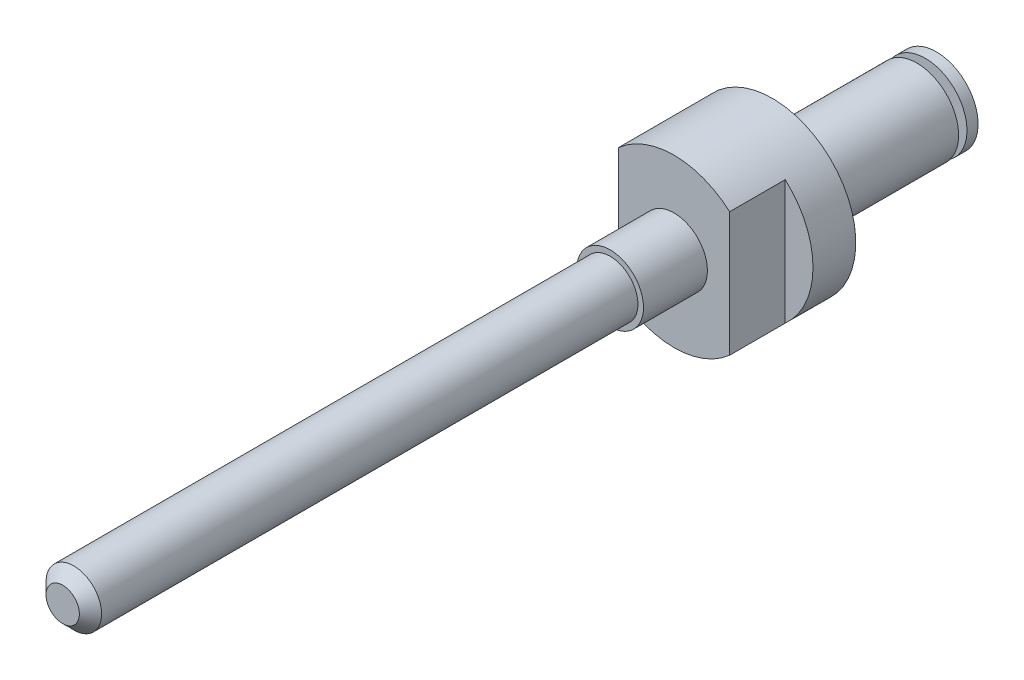
ISO-10303-21;
HEADER;
FILE_DESCRIPTION(('STEP AP214'),'2;1');
FILE_NAME('part.step','',(''),(''),'','','');
FILE_SCHEMA(('AUTOMOTIVE_DESIGN { 1 0 10303 214 1 1 1 1 }'));
ENDSEC;
DATA;
#1=APPLICATION_CONTEXT('core data for automotive mechanical design processes');
#2=APPLICATION_PROTOCOL_DEFINITION('international standard','automotive_design',2000,#1);
#3=PRODUCT_CONTEXT('',#1,'mechanical');
#4=PRODUCT('Part','Part','',(#3));
#5=PRODUCT_RELATED_PRODUCT_CATEGORY('part','',(#4));
#6=PRODUCT_DEFINITION_FORMATION('','',#4);
#7=PRODUCT_DEFINITION_CONTEXT('part definition',#1,'design');
#8=PRODUCT_DEFINITION('design','',#6,#7);
#9=PRODUCT_DEFINITION_SHAPE('','',#8);
#10=(LENGTH_UNIT() NAMED_UNIT(*) SI_UNIT(.MILLI.,.METRE.));
#11=(NAMED_UNIT(*) PLANE_ANGLE_UNIT() SI_UNIT($,.RADIAN.));
#12=(NAMED_UNIT(*) SI_UNIT($,.STERADIAN.) SOLID_ANGLE_UNIT());
#13=UNCERTAINTY_MEASURE_WITH_UNIT(LENGTH_MEASURE(1.E-05),#10,'distance_accuracy_value','');
#14=(GEOMETRIC_REPRESENTATION_CONTEXT(3) GLOBAL_UNCERTAINTY_ASSIGNED_CONTEXT((#13)) GLOBAL_UNIT_ASSIGNED_CONTEXT((#10,
#11,#12)) REPRESENTATION_CONTEXT('',''));
#15=CARTESIAN_POINT('',(0.,0.,0.));
#16=DIRECTION('',(0.,0.,1.));
#17=DIRECTION('',(1.,0.,0.));
#18=AXIS2_PLACEMENT_3D('',#15,#16,#17);
#19=CARTESIAN_POINT('',(0.,0.,11.));
#20=DIRECTION('',(0.,0.,-1.));
#21=DIRECTION('',(-1.,0.,0.));
#22=AXIS2_PLACEMENT_3D('',#19,#20,#21);
#23=CYLINDRICAL_SURFACE('',#22,0.6);
#24=CARTESIAN_POINT('',(0.,0.,0.));
#25=DIRECTION('',(0.,0.,1.));
#26=DIRECTION('',(1.,0.,0.));
#27=AXIS2_PLACEMENT_3D('',#24,#25,#26);
#28=CIRCLE('',#27,0.6);
#29=CARTESIAN_POINT('',(0.6,0.,0.));
#30=VERTEX_POINT('',#29);
#31=EDGE_CURVE('E90',#30,#30,#28,.T.);
#32=ORIENTED_EDGE('',*,*,#31,.T.);
#33=EDGE_LOOP('',(#32));
#34=FACE_BOUND('',#33,.T.);
#35=CARTESIAN_POINT('',(0.,0.,1.15));
#36=DIRECTION('',(0.,0.,1.));
#37=DIRECTION('',(1.,0.,0.));
#38=AXIS2_PLACEMENT_3D('',#35,#36,#37);
#39=CIRCLE('',#38,0.6);
#40=CARTESIAN_POINT('',(0.6,0.,1.15));
#41=VERTEX_POINT('',#40);
#42=EDGE_CURVE('E290',#41,#41,#39,.T.);
#43=ORIENTED_EDGE('',*,*,#42,.F.);
#44=EDGE_LOOP('',(#43));
#45=FACE_BOUND('',#44,.T.);
#46=ADVANCED_FACE('F33',(#34,#45),#23,.T.);
#47=CARTESIAN_POINT('',(0.,0.,0.));
#48=DIRECTION('',(0.,0.,1.));
#49=DIRECTION('',(1.,0.,0.));
#50=AXIS2_PLACEMENT_3D('',#47,#48,#49);
#51=PLANE('',#50);
#52=ORIENTED_EDGE('',*,*,#31,.F.);
#53=EDGE_LOOP('',(#52));
#54=FACE_BOUND('',#53,.T.);
#55=DIRECTION('',(0.,-1.,0.));
#56=VECTOR('',#55,1.);
#57=CARTESIAN_POINT('',(1.,1.5,0.));
#58=LINE('',#57,#56);
#59=CARTESIAN_POINT('',(1.,1.11803398874989,0.));
#60=VERTEX_POINT('',#59);
#61=CARTESIAN_POINT('',(1.,-1.11803398874989,0.));
#62=VERTEX_POINT('',#61);
#63=EDGE_CURVE('E76',#60,#62,#58,.T.);
#64=ORIENTED_EDGE('',*,*,#63,.F.);
#65=CARTESIAN_POINT('',(0.,0.,0.));
#66=DIRECTION('',(0.,0.,-1.));
#67=DIRECTION('',(-1.,0.,0.));
#68=AXIS2_PLACEMENT_3D('',#65,#66,#67);
#69=CIRCLE('',#68,1.5);
#70=CARTESIAN_POINT('',(-1.,1.11803398874989,0.));
#71=VERTEX_POINT('',#70);
#72=EDGE_CURVE('E88',#71,#60,#69,.T.);
#73=ORIENTED_EDGE('',*,*,#72,.F.);
#74=DIRECTION('',(0.,1.,0.));
#75=VECTOR('',#74,1.);
#76=CARTESIAN_POINT('',(-1.,1.5,0.));
#77=LINE('',#76,#75);
#78=CARTESIAN_POINT('',(-1.,-1.11803398874989,0.));
#79=VERTEX_POINT('',#78);
#80=EDGE_CURVE('E296',#79,#71,#77,.T.);
#81=ORIENTED_EDGE('',*,*,#80,.F.);
#82=EDGE_CURVE('E89',#62,#79,#69,.T.);
#83=ORIENTED_EDGE('',*,*,#82,.F.);
#84=EDGE_LOOP('',(#64,#73,#81,#83));
#85=FACE_BOUND('',#84,.T.);
#86=ADVANCED_FACE('F86',(#54,#85),#51,.T.);
#87=CARTESIAN_POINT('',(0.,0.,-4.72));
#88=DIRECTION('',(0.,0.,-1.));
#89=DIRECTION('',(-1.,0.,0.));
#90=AXIS2_PLACEMENT_3D('',#87,#88,#89);
#91=CYLINDRICAL_SURFACE('',#90,1.5);
#92=DIRECTION('',(0.,0.,-1.));
#93=VECTOR('',#92,1.);
#94=CARTESIAN_POINT('',(1.,1.11803398874989,-4.72));
#95=LINE('',#94,#93);
#96=CARTESIAN_POINT('',(1.,1.11803398874989,-1.));
#97=VERTEX_POINT('',#96);
#98=EDGE_CURVE('E73',#97,#60,#95,.F.);
#99=ORIENTED_EDGE('',*,*,#98,.F.);
#100=CARTESIAN_POINT('',(0.,0.,-1.));
#101=DIRECTION('',(0.,0.,1.));
#102=DIRECTION('',(1.,0.,0.));
#103=AXIS2_PLACEMENT_3D('',#100,#101,#102);
#104=CIRCLE('',#103,1.5);
#105=CARTESIAN_POINT('',(1.,-1.11803398874989,-1.));
#106=VERTEX_POINT('',#105);
#107=EDGE_CURVE('E108',#97,#106,#104,.F.);
#108=ORIENTED_EDGE('',*,*,#107,.T.);
#109=DIRECTION('',(0.,0.,-1.));
#110=VECTOR('',#109,1.);
#111=CARTESIAN_POINT('',(1.,-1.11803398874989,-4.72));
#112=LINE('',#111,#110);
#113=EDGE_CURVE('E81',#62,#106,#112,.T.);
#114=ORIENTED_EDGE('',*,*,#113,.F.);
#115=ORIENTED_EDGE('',*,*,#82,.T.);
#116=DIRECTION('',(0.,0.,-1.));
#117=VECTOR('',#116,1.);
#118=CARTESIAN_POINT('',(-1.,-1.1180339887499,-4.72));
#119=LINE('',#118,#117);
#120=CARTESIAN_POINT('',(-1.,-1.11803398874989,-1.));
#121=VERTEX_POINT('',#120);
#122=EDGE_CURVE('E105',#121,#79,#119,.F.);
#123=ORIENTED_EDGE('',*,*,#122,.F.);
#124=CARTESIAN_POINT('',(0.,0.,-1.));
#125=DIRECTION('',(0.,0.,1.));
#126=DIRECTION('',(1.,0.,0.));
#127=AXIS2_PLACEMENT_3D('',#124,#125,#126);
#128=CIRCLE('',#127,1.5);
#129=CARTESIAN_POINT('',(-1.,1.11803398874989,-1.));
#130=VERTEX_POINT('',#129);
#131=EDGE_CURVE('E97',#121,#130,#128,.F.);
#132=ORIENTED_EDGE('',*,*,#131,.T.);
#133=DIRECTION('',(0.,0.,-1.));
#134=VECTOR('',#133,1.);
#135=CARTESIAN_POINT('',(-1.,1.1180339887499,-4.72));
#136=LINE('',#135,#134);
#137=EDGE_CURVE('E96',#71,#130,#136,.T.);
#138=ORIENTED_EDGE('',*,*,#137,.F.);
#139=ORIENTED_EDGE('',*,*,#72,.T.);
#140=EDGE_LOOP('',(#99,#108,#114,#115,#123,#132,#138,#139));
#141=FACE_BOUND('',#140,.T.);
#142=CARTESIAN_POINT('',(0.,0.,-1.77));
#143=DIRECTION('',(0.,0.,-1.));
#144=DIRECTION('',(-1.,0.,0.));
#145=AXIS2_PLACEMENT_3D('',#142,#143,#144);
#146=CIRCLE('',#145,1.5);
#147=CARTESIAN_POINT('',(-1.5,0.,-1.77));
#148=VERTEX_POINT('',#147);
#149=EDGE_CURVE('E100',#148,#148,#146,.T.);
#150=ORIENTED_EDGE('',*,*,#149,.F.);
#151=EDGE_LOOP('',(#150));
#152=FACE_BOUND('',#151,.T.);
#153=ADVANCED_FACE('F93',(#141,#152),#91,.T.);
#154=CARTESIAN_POINT('',(-1.5,0.,-1.77));
#155=DIRECTION('',(0.,0.,-1.));
#156=DIRECTION('',(-1.,0.,0.));
#157=AXIS2_PLACEMENT_3D('',#154,#155,#156);
#158=PLANE('',#157);
#159=ORIENTED_EDGE('',*,*,#149,.T.);
#160=EDGE_LOOP('',(#159));
#161=FACE_BOUND('',#160,.T.);
#162=CARTESIAN_POINT('',(0.,0.,-1.77));
#163=DIRECTION('',(0.,0.,-1.));
#164=DIRECTION('',(-1.,0.,0.));
#165=AXIS2_PLACEMENT_3D('',#162,#163,#164);
#166=CIRCLE('',#165,0.75);
#167=CARTESIAN_POINT('',(-0.75,0.,-1.77));
#168=VERTEX_POINT('',#167);
#169=EDGE_CURVE('E314',#168,#168,#166,.T.);
#170=ORIENTED_EDGE('',*,*,#169,.F.);
#171=EDGE_LOOP('',(#170));
#172=FACE_BOUND('',#171,.T.);
#173=ADVANCED_FACE('F170',(#161,#172),#158,.T.);
#174=CARTESIAN_POINT('',(0.,0.,-4.72));
#175=DIRECTION('',(0.,0.,-1.));
#176=DIRECTION('',(-1.,0.,0.));
#177=AXIS2_PLACEMENT_3D('',#174,#175,#176);
#178=CYLINDRICAL_SURFACE('',#177,0.75);
#179=ORIENTED_EDGE('',*,*,#169,.T.);
#180=EDGE_LOOP('',(#179));
#181=FACE_BOUND('',#180,.T.);
#182=CARTESIAN_POINT('',(0.,0.,-4.37));
#183=DIRECTION('',(0.,0.,-1.));
#184=DIRECTION('',(-1.,0.,0.));
#185=AXIS2_PLACEMENT_3D('',#182,#183,#184);
#186=CIRCLE('',#185,0.75);
#187=CARTESIAN_POINT('',(-0.75,0.,-4.37));
#188=VERTEX_POINT('',#187);
#189=EDGE_CURVE('E312',#188,#188,#186,.T.);
#190=ORIENTED_EDGE('',*,*,#189,.F.);
#191=EDGE_LOOP('',(#190));
#192=FACE_BOUND('',#191,.T.);
#193=ADVANCED_FACE('F166',(#181,#192),#178,.T.);
#194=CARTESIAN_POINT('',(-0.75,0.,-4.37));
#195=DIRECTION('',(0.,0.,-1.));
#196=DIRECTION('',(-1.,0.,0.));
#197=AXIS2_PLACEMENT_3D('',#194,#195,#196);
#198=PLANE('',#197);
#199=ORIENTED_EDGE('',*,*,#189,.T.);
#200=EDGE_LOOP('',(#199));
#201=FACE_BOUND('',#200,.T.);
#202=CARTESIAN_POINT('',(0.,0.,-4.37));
#203=DIRECTION('',(0.,0.,-1.));
#204=DIRECTION('',(-1.,0.,0.));
#205=AXIS2_PLACEMENT_3D('',#202,#203,#204);
#206=CIRCLE('',#205,0.5);
#207=CARTESIAN_POINT('',(-0.5,0.,-4.37));
#208=VERTEX_POINT('',#207);
#209=EDGE_CURVE('E309',#208,#208,#206,.T.);
#210=ORIENTED_EDGE('',*,*,#209,.F.);
#211=EDGE_LOOP('',(#210));
#212=FACE_BOUND('',#211,.T.);
#213=ADVANCED_FACE('F162',(#201,#212),#198,.T.);
#214=CARTESIAN_POINT('',(0.,0.,-4.72));
#215=DIRECTION('',(0.,0.,-1.));
#216=DIRECTION('',(-1.,0.,0.));
#217=AXIS2_PLACEMENT_3D('',#214,#215,#216);
#218=CYLINDRICAL_SURFACE('',#217,0.5);
#219=ORIENTED_EDGE('',*,*,#209,.T.);
#220=EDGE_LOOP('',(#219));
#221=FACE_BOUND('',#220,.T.);
#222=CARTESIAN_POINT('',(0.,0.,-4.52));
#223=DIRECTION('',(0.,0.,-1.));
#224=DIRECTION('',(-1.,0.,0.));
#225=AXIS2_PLACEMENT_3D('',#222,#223,#224);
#226=CIRCLE('',#225,0.5);
#227=CARTESIAN_POINT('',(-0.5,0.,-4.52));
#228=VERTEX_POINT('',#227);
#229=EDGE_CURVE('E306',#228,#228,#226,.T.);
#230=ORIENTED_EDGE('',*,*,#229,.F.);
#231=EDGE_LOOP('',(#230));
#232=FACE_BOUND('',#231,.T.);
#233=ADVANCED_FACE('F158',(#221,#232),#218,.T.);
#234=CARTESIAN_POINT('',(-0.5,0.,-4.52));
#235=DIRECTION('',(0.,0.,1.));
#236=DIRECTION('',(1.,0.,0.));
#237=AXIS2_PLACEMENT_3D('',#234,#235,#236);
#238=PLANE('',#237);
#239=ORIENTED_EDGE('',*,*,#229,.T.);
#240=EDGE_LOOP('',(#239));
#241=FACE_BOUND('',#240,.T.);
#242=CARTESIAN_POINT('',(0.,0.,-4.52));
#243=DIRECTION('',(0.,0.,-1.));
#244=DIRECTION('',(-1.,0.,0.));
#245=AXIS2_PLACEMENT_3D('',#242,#243,#244);
#246=CIRCLE('',#245,0.75);
#247=CARTESIAN_POINT('',(-0.75,0.,-4.52));
#248=VERTEX_POINT('',#247);
#249=EDGE_CURVE('E303',#248,#248,#246,.T.);
#250=ORIENTED_EDGE('',*,*,#249,.F.);
#251=EDGE_LOOP('',(#250));
#252=FACE_BOUND('',#251,.T.);
#253=ADVANCED_FACE('F154',(#241,#252),#238,.T.);
#254=CARTESIAN_POINT('',(0.,0.,-4.72));
#255=DIRECTION('',(0.,0.,-1.));
#256=DIRECTION('',(-1.,0.,0.));
#257=AXIS2_PLACEMENT_3D('',#254,#255,#256);
#258=CYLINDRICAL_SURFACE('',#257,0.75);
#259=ORIENTED_EDGE('',*,*,#249,.T.);
#260=EDGE_LOOP('',(#259));
#261=FACE_BOUND('',#260,.T.);
#262=CARTESIAN_POINT('',(0.,0.,-4.72));
#263=DIRECTION('',(0.,0.,-1.));
#264=DIRECTION('',(-1.,0.,0.));
#265=AXIS2_PLACEMENT_3D('',#262,#263,#264);
#266=CIRCLE('',#265,0.75);
#267=CARTESIAN_POINT('',(-0.75,0.,-4.72));
#268=VERTEX_POINT('',#267);
#269=EDGE_CURVE('E299',#268,#268,#266,.T.);
#270=ORIENTED_EDGE('',*,*,#269,.F.);
#271=EDGE_LOOP('',(#270));
#272=FACE_BOUND('',#271,.T.);
#273=ADVANCED_FACE('F150',(#261,#272),#258,.T.);
#274=CARTESIAN_POINT('',(-0.75,0.,-4.72));
#275=DIRECTION('',(0.,0.,-1.));
#276=DIRECTION('',(-1.,0.,0.));
#277=AXIS2_PLACEMENT_3D('',#274,#275,#276);
#278=PLANE('',#277);
#279=ORIENTED_EDGE('',*,*,#269,.T.);
#280=EDGE_LOOP('',(#279));
#281=FACE_BOUND('',#280,.T.);
#282=ADVANCED_FACE('F146',(#281),#278,.T.);
#283=CARTESIAN_POINT('',(-1.,1.5,-1.));
#284=DIRECTION('',(1.,0.,0.));
#285=DIRECTION('',(0.,1.,0.));
#286=AXIS2_PLACEMENT_3D('',#283,#284,#285);
#287=PLANE('',#286);
#288=ORIENTED_EDGE('',*,*,#122,.T.);
#289=ORIENTED_EDGE('',*,*,#80,.T.);
#290=ORIENTED_EDGE('',*,*,#137,.T.);
#291=DIRECTION('',(0.,1.,0.));
#292=VECTOR('',#291,1.);
#293=CARTESIAN_POINT('',(-1.,1.5,-1.));
#294=LINE('',#293,#292);
#295=EDGE_CURVE('E54',#121,#130,#294,.T.);
#296=ORIENTED_EDGE('',*,*,#295,.F.);
#297=EDGE_LOOP('',(#288,#289,#290,#296));
#298=FACE_BOUND('',#297,.T.);
#299=ADVANCED_FACE('F143',(#298),#287,.F.);
#300=CARTESIAN_POINT('',(0.,0.,-1.));
#301=DIRECTION('',(0.,0.,1.));
#302=DIRECTION('',(1.,0.,0.));
#303=AXIS2_PLACEMENT_3D('',#300,#301,#302);
#304=PLANE('',#303);
#305=ORIENTED_EDGE('',*,*,#295,.T.);
#306=ORIENTED_EDGE('',*,*,#131,.F.);
#307=EDGE_LOOP('',(#305,#306));
#308=FACE_BOUND('',#307,.T.);
#309=ADVANCED_FACE('F140',(#308),#304,.T.);
#310=CARTESIAN_POINT('',(1.,1.5,-1.));
#311=DIRECTION('',(-1.,0.,0.));
#312=DIRECTION('',(0.,0.,1.));
#313=AXIS2_PLACEMENT_3D('',#310,#311,#312);
#314=PLANE('',#313);
#315=ORIENTED_EDGE('',*,*,#98,.T.);
#316=ORIENTED_EDGE('',*,*,#63,.T.);
#317=ORIENTED_EDGE('',*,*,#113,.T.);
#318=DIRECTION('',(0.,-1.,0.));
#319=VECTOR('',#318,1.);
#320=CARTESIAN_POINT('',(1.,1.5,-1.));
#321=LINE('',#320,#319);
#322=EDGE_CURVE('E47',#97,#106,#321,.T.);
#323=ORIENTED_EDGE('',*,*,#322,.F.);
#324=EDGE_LOOP('',(#315,#316,#317,#323));
#325=FACE_BOUND('',#324,.T.);
#326=ADVANCED_FACE('F75',(#325),#314,.F.);
#327=CARTESIAN_POINT('',(0.,0.,-1.));
#328=DIRECTION('',(0.,0.,1.));
#329=DIRECTION('',(1.,0.,0.));
#330=AXIS2_PLACEMENT_3D('',#327,#328,#329);
#331=PLANE('',#330);
#332=ORIENTED_EDGE('',*,*,#322,.T.);
#333=ORIENTED_EDGE('',*,*,#107,.F.);
#334=EDGE_LOOP('',(#332,#333));
#335=FACE_BOUND('',#334,.T.);
#336=ADVANCED_FACE('F134',(#335),#331,.T.);
#337=CARTESIAN_POINT('',(0.,0.,1.15));
#338=DIRECTION('',(0.,0.,1.));
#339=DIRECTION('',(1.,0.,0.));
#340=AXIS2_PLACEMENT_3D('',#337,#338,#339);
#341=PLANE('',#340);
#342=ORIENTED_EDGE('',*,*,#42,.T.);
#343=EDGE_LOOP('',(#342));
#344=FACE_BOUND('',#343,.T.);
#345=CARTESIAN_POINT('',(0.,0.,1.15));
#346=DIRECTION('',(0.,0.,1.));
#347=DIRECTION('',(1.,0.,0.));
#348=AXIS2_PLACEMENT_3D('',#345,#346,#347);
#349=CIRCLE('',#348,0.5);
#350=CARTESIAN_POINT('',(0.5,0.,1.15));
#351=VERTEX_POINT('',#350);
#352=EDGE_CURVE('E288',#351,#351,#349,.T.);
#353=ORIENTED_EDGE('',*,*,#352,.F.);
#354=EDGE_LOOP('',(#353));
#355=FACE_BOUND('',#354,.T.);
#356=ADVANCED_FACE('F137',(#344,#355),#341,.T.);
#357=CARTESIAN_POINT('',(0.,0.,11.));
#358=DIRECTION('',(0.,0.,-1.));
#359=DIRECTION('',(-1.,0.,0.));
#360=AXIS2_PLACEMENT_3D('',#357,#358,#359);
#361=CYLINDRICAL_SURFACE('',#360,0.5);
#362=CARTESIAN_POINT('',(0.,0.,10.8));
#363=DIRECTION('',(0.,0.,1.));
#364=DIRECTION('',(1.,0.,0.));
#365=AXIS2_PLACEMENT_3D('',#362,#363,#364);
#366=CIRCLE('',#365,0.5);
#367=CARTESIAN_POINT('',(0.5,0.,10.8));
#368=VERTEX_POINT('',#367);
#369=EDGE_CURVE('E11',#368,#368,#366,.F.);
#370=ORIENTED_EDGE('',*,*,#369,.T.);
#371=EDGE_LOOP('',(#370));
#372=FACE_BOUND('',#371,.T.);
#373=ORIENTED_EDGE('',*,*,#352,.T.);
#374=EDGE_LOOP('',(#373));
#375=FACE_BOUND('',#374,.T.);
#376=ADVANCED_FACE('F120',(#372,#375),#361,.T.);
#377=CARTESIAN_POINT('',(0.,0.,11.));
#378=DIRECTION('',(0.,0.,1.));
#379=DIRECTION('',(1.,0.,0.));
#380=AXIS2_PLACEMENT_3D('',#377,#378,#379);
#381=PLANE('',#380);
#382=CARTESIAN_POINT('',(0.,0.,11.));
#383=DIRECTION('',(0.,0.,1.));
#384=DIRECTION('',(1.,0.,0.));
#385=AXIS2_PLACEMENT_3D('',#382,#383,#384);
#386=CIRCLE('',#385,0.3);
#387=CARTESIAN_POINT('',(0.3,0.,11.));
#388=VERTEX_POINT('',#387);
#389=EDGE_CURVE('E41',#388,#388,#386,.T.);
#390=ORIENTED_EDGE('',*,*,#389,.T.);
#391=EDGE_LOOP('',(#390));
#392=FACE_BOUND('',#391,.T.);
#393=ADVANCED_FACE('F113',(#392),#381,.T.);
#394=CARTESIAN_POINT('',(0.,0.,11.));
#395=DIRECTION('',(0.,0.,-1.));
#396=DIRECTION('',(-1.,0.,0.));
#397=AXIS2_PLACEMENT_3D('',#394,#395,#396);
#398=CONICAL_SURFACE('',#397,0.3,0.785398163397443);
#399=ORIENTED_EDGE('',*,*,#369,.F.);
#400=EDGE_LOOP('',(#399));
#401=FACE_BOUND('',#400,.T.);
#402=ORIENTED_EDGE('',*,*,#389,.F.);
#403=EDGE_LOOP('',(#402));
#404=FACE_BOUND('',#403,.T.);
#405=ADVANCED_FACE('F35',(#401,#404),#398,.T.);
#406=CLOSED_SHELL('',(#46,#86,#153,#173,#193,#213,#233,#253,#273,#282,#299,#309,#326,#336,#356,
#376,#393,#405));
#407=MANIFOLD_SOLID_BREP('B2',#406);
#408=ADVANCED_BREP_SHAPE_REPRESENTATION('',(#18,#407),#14);
#409=SHAPE_DEFINITION_REPRESENTATION(#9,#408);
ENDSEC;
END-ISO-10303-21;
